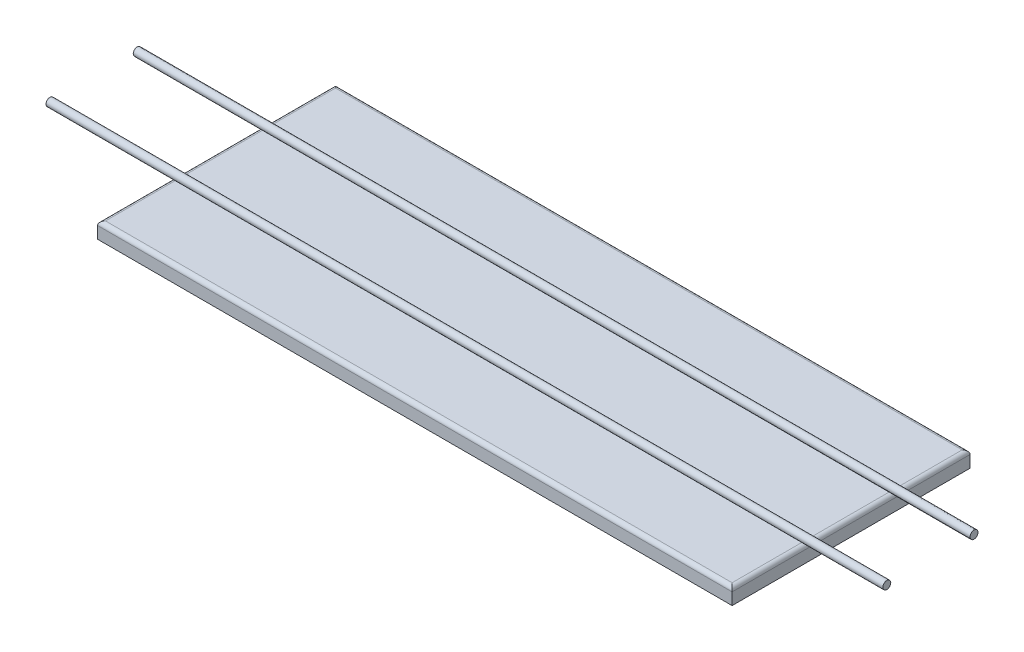
ISO-10303-21;
HEADER;
FILE_DESCRIPTION(('STEP AP214'),'2;1');
FILE_NAME('part.step','',(''),(''),'','','');
FILE_SCHEMA(('AUTOMOTIVE_DESIGN { 1 0 10303 214 1 1 1 1 }'));
ENDSEC;
DATA;
#1=APPLICATION_CONTEXT('core data for automotive mechanical design processes');
#2=APPLICATION_PROTOCOL_DEFINITION('international standard','automotive_design',2000,#1);
#3=PRODUCT_CONTEXT('',#1,'mechanical');
#4=PRODUCT('Part','Part','',(#3));
#5=PRODUCT_RELATED_PRODUCT_CATEGORY('part','',(#4));
#6=PRODUCT_DEFINITION_FORMATION('','',#4);
#7=PRODUCT_DEFINITION_CONTEXT('part definition',#1,'design');
#8=PRODUCT_DEFINITION('design','',#6,#7);
#9=PRODUCT_DEFINITION_SHAPE('','',#8);
#10=(LENGTH_UNIT() NAMED_UNIT(*) SI_UNIT(.MILLI.,.METRE.));
#11=(NAMED_UNIT(*) PLANE_ANGLE_UNIT() SI_UNIT($,.RADIAN.));
#12=(NAMED_UNIT(*) SI_UNIT($,.STERADIAN.) SOLID_ANGLE_UNIT());
#13=UNCERTAINTY_MEASURE_WITH_UNIT(LENGTH_MEASURE(1.E-05),#10,'distance_accuracy_value','');
#14=(GEOMETRIC_REPRESENTATION_CONTEXT(3) GLOBAL_UNCERTAINTY_ASSIGNED_CONTEXT((#13)) GLOBAL_UNIT_ASSIGNED_CONTEXT((#10,
#11,#12)) REPRESENTATION_CONTEXT('',''));
#15=CARTESIAN_POINT('',(0.,0.,0.));
#16=DIRECTION('',(0.,0.,1.));
#17=DIRECTION('',(1.,0.,0.));
#18=AXIS2_PLACEMENT_3D('',#15,#16,#17);
#19=CARTESIAN_POINT('',(-555.,25.0000000000001,-55.0000000000001));
#20=DIRECTION('',(1.,0.,0.));
#21=DIRECTION('',(0.,0.,-1.));
#22=AXIS2_PLACEMENT_3D('',#19,#20,#21);
#23=CYLINDRICAL_SURFACE('',#22,5.);
#24=CARTESIAN_POINT('',(-555.,25.0000000000001,-55.0000000000001));
#25=DIRECTION('',(1.,0.,0.));
#26=DIRECTION('',(0.,0.,1.));
#27=AXIS2_PLACEMENT_3D('',#24,#25,#26);
#28=CIRCLE('',#27,5.);
#29=CARTESIAN_POINT('',(-555.,25.0000000000001,-50.0000000000001));
#30=VERTEX_POINT('',#29);
#31=EDGE_CURVE('E11',#30,#30,#28,.T.);
#32=ORIENTED_EDGE('',*,*,#31,.T.);
#33=EDGE_LOOP('',(#32));
#34=FACE_BOUND('',#33,.T.);
#35=CARTESIAN_POINT('',(500.,25.0000000000001,-55.0000000000001));
#36=DIRECTION('',(1.,0.,0.));
#37=DIRECTION('',(0.,0.,1.));
#38=AXIS2_PLACEMENT_3D('',#35,#36,#37);
#39=CIRCLE('',#38,5.);
#40=CARTESIAN_POINT('',(500.,25.0000000000001,-50.0000000000001));
#41=VERTEX_POINT('',#40);
#42=EDGE_CURVE('E46',#41,#41,#39,.T.);
#43=ORIENTED_EDGE('',*,*,#42,.F.);
#44=EDGE_LOOP('',(#43));
#45=FACE_BOUND('',#44,.T.);
#46=ADVANCED_FACE('F40',(#34,#45),#23,.T.);
#47=CARTESIAN_POINT('',(-555.,25.0000000000001,-55.0000000000001));
#48=DIRECTION('',(-1.,0.,0.));
#49=DIRECTION('',(0.,0.,1.));
#50=AXIS2_PLACEMENT_3D('',#47,#48,#49);
#51=PLANE('',#50);
#52=ORIENTED_EDGE('',*,*,#31,.F.);
#53=EDGE_LOOP('',(#52));
#54=FACE_BOUND('',#53,.T.);
#55=ADVANCED_FACE('F55',(#54),#51,.T.);
#56=CARTESIAN_POINT('',(500.,25.0000000000001,-55.0000000000001));
#57=DIRECTION('',(-1.,0.,0.));
#58=DIRECTION('',(0.,0.,1.));
#59=AXIS2_PLACEMENT_3D('',#56,#57,#58);
#60=PLANE('',#59);
#61=ORIENTED_EDGE('',*,*,#42,.T.);
#62=EDGE_LOOP('',(#61));
#63=FACE_BOUND('',#62,.T.);
#64=ADVANCED_FACE('F52',(#63),#60,.F.);
#65=CLOSED_SHELL('',(#46,#55,#64));
#66=MANIFOLD_SOLID_BREP('B2',#65);
#67=CARTESIAN_POINT('',(-555.,25.,55.));
#68=DIRECTION('',(1.,0.,0.));
#69=DIRECTION('',(0.,0.,-1.));
#70=AXIS2_PLACEMENT_3D('',#67,#68,#69);
#71=CYLINDRICAL_SURFACE('',#70,5.);
#72=CARTESIAN_POINT('',(-555.,25.,55.));
#73=DIRECTION('',(1.,0.,0.));
#74=DIRECTION('',(0.,0.,-1.));
#75=AXIS2_PLACEMENT_3D('',#72,#73,#74);
#76=CIRCLE('',#75,5.);
#77=CARTESIAN_POINT('',(-555.,25.,50.));
#78=VERTEX_POINT('',#77);
#79=EDGE_CURVE('E39',#78,#78,#76,.T.);
#80=ORIENTED_EDGE('',*,*,#79,.T.);
#81=EDGE_LOOP('',(#80));
#82=FACE_BOUND('',#81,.T.);
#83=CARTESIAN_POINT('',(500.,25.,55.));
#84=DIRECTION('',(1.,0.,0.));
#85=DIRECTION('',(0.,0.,-1.));
#86=AXIS2_PLACEMENT_3D('',#83,#84,#85);
#87=CIRCLE('',#86,5.);
#88=CARTESIAN_POINT('',(500.,25.,50.));
#89=VERTEX_POINT('',#88);
#90=EDGE_CURVE('E96',#89,#89,#87,.T.);
#91=ORIENTED_EDGE('',*,*,#90,.F.);
#92=EDGE_LOOP('',(#91));
#93=FACE_BOUND('',#92,.T.);
#94=ADVANCED_FACE('F90',(#82,#93),#71,.T.);
#95=CARTESIAN_POINT('',(-555.,25.,55.));
#96=DIRECTION('',(1.,0.,0.));
#97=DIRECTION('',(0.,0.,-1.));
#98=AXIS2_PLACEMENT_3D('',#95,#96,#97);
#99=PLANE('',#98);
#100=ORIENTED_EDGE('',*,*,#79,.F.);
#101=EDGE_LOOP('',(#100));
#102=FACE_BOUND('',#101,.T.);
#103=ADVANCED_FACE('F105',(#102),#99,.F.);
#104=CARTESIAN_POINT('',(500.,25.,55.));
#105=DIRECTION('',(1.,0.,0.));
#106=DIRECTION('',(0.,0.,-1.));
#107=AXIS2_PLACEMENT_3D('',#104,#105,#106);
#108=PLANE('',#107);
#109=ORIENTED_EDGE('',*,*,#90,.T.);
#110=EDGE_LOOP('',(#109));
#111=FACE_BOUND('',#110,.T.);
#112=ADVANCED_FACE('F102',(#111),#108,.T.);
#113=CLOSED_SHELL('',(#94,#103,#112));
#114=MANIFOLD_SOLID_BREP('B6',#113);
#115=CARTESIAN_POINT('',(-400.,20.,150.));
#116=DIRECTION('',(1.,0.,0.));
#117=DIRECTION('',(0.,0.,-1.));
#118=AXIS2_PLACEMENT_3D('',#115,#116,#117);
#119=PLANE('',#118);
#120=DIRECTION('',(0.,-1.,0.));
#121=VECTOR('',#120,1.);
#122=CARTESIAN_POINT('',(-400.,20.,150.));
#123=LINE('',#122,#121);
#124=CARTESIAN_POINT('',(-400.,15.,150.));
#125=VERTEX_POINT('',#124);
#126=CARTESIAN_POINT('',(-400.,0.,150.));
#127=VERTEX_POINT('',#126);
#128=EDGE_CURVE('E182',#125,#127,#123,.T.);
#129=ORIENTED_EDGE('',*,*,#128,.F.);
#130=DIRECTION('',(0.,0.,1.));
#131=VECTOR('',#130,1.);
#132=CARTESIAN_POINT('',(-400.,15.,-150.));
#133=LINE('',#132,#131);
#134=CARTESIAN_POINT('',(-400.,15.,-150.));
#135=VERTEX_POINT('',#134);
#136=EDGE_CURVE('E88',#125,#135,#133,.F.);
#137=ORIENTED_EDGE('',*,*,#136,.T.);
#138=DIRECTION('',(0.,-1.,0.));
#139=VECTOR('',#138,1.);
#140=CARTESIAN_POINT('',(-400.,20.,-150.));
#141=LINE('',#140,#139);
#142=CARTESIAN_POINT('',(-400.,0.,-150.));
#143=VERTEX_POINT('',#142);
#144=EDGE_CURVE('E202',#135,#143,#141,.T.);
#145=ORIENTED_EDGE('',*,*,#144,.T.);
#146=DIRECTION('',(0.,0.,1.));
#147=VECTOR('',#146,1.);
#148=CARTESIAN_POINT('',(-400.,0.,150.));
#149=LINE('',#148,#147);
#150=EDGE_CURVE('E197',#143,#127,#149,.T.);
#151=ORIENTED_EDGE('',*,*,#150,.T.);
#152=EDGE_LOOP('',(#129,#137,#145,#151));
#153=FACE_BOUND('',#152,.T.);
#154=ADVANCED_FACE('F130',(#153),#119,.F.);
#155=CARTESIAN_POINT('',(400.,20.,150.));
#156=DIRECTION('',(0.,0.,-1.));
#157=DIRECTION('',(-1.,0.,0.));
#158=AXIS2_PLACEMENT_3D('',#155,#156,#157);
#159=PLANE('',#158);
#160=DIRECTION('',(0.,-1.,0.));
#161=VECTOR('',#160,1.);
#162=CARTESIAN_POINT('',(400.,20.,150.));
#163=LINE('',#162,#161);
#164=CARTESIAN_POINT('',(400.,15.,150.));
#165=VERTEX_POINT('',#164);
#166=CARTESIAN_POINT('',(400.,0.,150.));
#167=VERTEX_POINT('',#166);
#168=EDGE_CURVE('E191',#165,#167,#163,.T.);
#169=ORIENTED_EDGE('',*,*,#168,.F.);
#170=DIRECTION('',(1.,0.,0.));
#171=VECTOR('',#170,1.);
#172=CARTESIAN_POINT('',(-400.,15.,150.));
#173=LINE('',#172,#171);
#174=EDGE_CURVE('E139',#165,#125,#173,.F.);
#175=ORIENTED_EDGE('',*,*,#174,.T.);
#176=ORIENTED_EDGE('',*,*,#128,.T.);
#177=DIRECTION('',(1.,0.,0.));
#178=VECTOR('',#177,1.);
#179=CARTESIAN_POINT('',(400.,0.,150.));
#180=LINE('',#179,#178);
#181=EDGE_CURVE('E185',#127,#167,#180,.T.);
#182=ORIENTED_EDGE('',*,*,#181,.T.);
#183=EDGE_LOOP('',(#169,#175,#176,#182));
#184=FACE_BOUND('',#183,.T.);
#185=ADVANCED_FACE('F184',(#184),#159,.F.);
#186=CARTESIAN_POINT('',(400.,20.,150.));
#187=DIRECTION('',(-1.,0.,0.));
#188=DIRECTION('',(0.,0.,1.));
#189=AXIS2_PLACEMENT_3D('',#186,#187,#188);
#190=PLANE('',#189);
#191=DIRECTION('',(0.,-1.,0.));
#192=VECTOR('',#191,1.);
#193=CARTESIAN_POINT('',(400.,20.,-150.));
#194=LINE('',#193,#192);
#195=CARTESIAN_POINT('',(400.,15.,-150.));
#196=VERTEX_POINT('',#195);
#197=CARTESIAN_POINT('',(400.,0.,-150.));
#198=VERTEX_POINT('',#197);
#199=EDGE_CURVE('E212',#196,#198,#194,.T.);
#200=ORIENTED_EDGE('',*,*,#199,.F.);
#201=DIRECTION('',(0.,0.,-1.));
#202=VECTOR('',#201,1.);
#203=CARTESIAN_POINT('',(400.,15.,150.));
#204=LINE('',#203,#202);
#205=EDGE_CURVE('E154',#196,#165,#204,.F.);
#206=ORIENTED_EDGE('',*,*,#205,.T.);
#207=ORIENTED_EDGE('',*,*,#168,.T.);
#208=DIRECTION('',(0.,0.,-1.));
#209=VECTOR('',#208,1.);
#210=CARTESIAN_POINT('',(400.,0.,150.));
#211=LINE('',#210,#209);
#212=EDGE_CURVE('E199',#167,#198,#211,.T.);
#213=ORIENTED_EDGE('',*,*,#212,.T.);
#214=EDGE_LOOP('',(#200,#206,#207,#213));
#215=FACE_BOUND('',#214,.T.);
#216=ADVANCED_FACE('F250',(#215),#190,.F.);
#217=CARTESIAN_POINT('',(400.,20.,-150.));
#218=DIRECTION('',(0.,0.,1.));
#219=DIRECTION('',(1.,0.,0.));
#220=AXIS2_PLACEMENT_3D('',#217,#218,#219);
#221=PLANE('',#220);
#222=ORIENTED_EDGE('',*,*,#144,.F.);
#223=DIRECTION('',(-1.,0.,0.));
#224=VECTOR('',#223,1.);
#225=CARTESIAN_POINT('',(400.,15.,-150.));
#226=LINE('',#225,#224);
#227=EDGE_CURVE('E223',#135,#196,#226,.F.);
#228=ORIENTED_EDGE('',*,*,#227,.T.);
#229=ORIENTED_EDGE('',*,*,#199,.T.);
#230=DIRECTION('',(-1.,0.,0.));
#231=VECTOR('',#230,1.);
#232=CARTESIAN_POINT('',(400.,0.,-150.));
#233=LINE('',#232,#231);
#234=EDGE_CURVE('E209',#198,#143,#233,.T.);
#235=ORIENTED_EDGE('',*,*,#234,.T.);
#236=EDGE_LOOP('',(#222,#228,#229,#235));
#237=FACE_BOUND('',#236,.T.);
#238=ADVANCED_FACE('F249',(#237),#221,.F.);
#239=CARTESIAN_POINT('',(-400.,20.,-150.));
#240=DIRECTION('',(0.,1.,0.));
#241=DIRECTION('',(0.,0.,1.));
#242=AXIS2_PLACEMENT_3D('',#239,#240,#241);
#243=PLANE('',#242);
#244=DIRECTION('',(0.,0.,-1.));
#245=VECTOR('',#244,1.);
#246=CARTESIAN_POINT('',(395.,20.,-150.));
#247=LINE('',#246,#245);
#248=CARTESIAN_POINT('',(395.,20.,145.));
#249=VERTEX_POINT('',#248);
#250=CARTESIAN_POINT('',(395.,20.,-145.));
#251=VERTEX_POINT('',#250);
#252=EDGE_CURVE('E218',#249,#251,#247,.T.);
#253=ORIENTED_EDGE('',*,*,#252,.T.);
#254=DIRECTION('',(-1.,0.,0.));
#255=VECTOR('',#254,1.);
#256=CARTESIAN_POINT('',(-400.,20.,-145.));
#257=LINE('',#256,#255);
#258=CARTESIAN_POINT('',(-395.,20.,-145.));
#259=VERTEX_POINT('',#258);
#260=EDGE_CURVE('E220',#251,#259,#257,.T.);
#261=ORIENTED_EDGE('',*,*,#260,.T.);
#262=DIRECTION('',(0.,0.,1.));
#263=VECTOR('',#262,1.);
#264=CARTESIAN_POINT('',(-395.,20.,150.));
#265=LINE('',#264,#263);
#266=CARTESIAN_POINT('',(-395.,20.,145.));
#267=VERTEX_POINT('',#266);
#268=EDGE_CURVE('E190',#259,#267,#265,.T.);
#269=ORIENTED_EDGE('',*,*,#268,.T.);
#270=DIRECTION('',(1.,0.,0.));
#271=VECTOR('',#270,1.);
#272=CARTESIAN_POINT('',(400.,20.,145.));
#273=LINE('',#272,#271);
#274=EDGE_CURVE('E216',#267,#249,#273,.T.);
#275=ORIENTED_EDGE('',*,*,#274,.T.);
#276=EDGE_LOOP('',(#253,#261,#269,#275));
#277=FACE_BOUND('',#276,.T.);
#278=ADVANCED_FACE('F242',(#277),#243,.T.);
#279=CARTESIAN_POINT('',(-400.,0.,-150.));
#280=DIRECTION('',(0.,1.,0.));
#281=DIRECTION('',(0.,0.,1.));
#282=AXIS2_PLACEMENT_3D('',#279,#280,#281);
#283=PLANE('',#282);
#284=ORIENTED_EDGE('',*,*,#150,.F.);
#285=ORIENTED_EDGE('',*,*,#234,.F.);
#286=ORIENTED_EDGE('',*,*,#212,.F.);
#287=ORIENTED_EDGE('',*,*,#181,.F.);
#288=EDGE_LOOP('',(#284,#285,#286,#287));
#289=FACE_BOUND('',#288,.T.);
#290=ADVANCED_FACE('F195',(#289),#283,.F.);
#291=CARTESIAN_POINT('',(-400.,15.,145.));
#292=DIRECTION('',(-1.,0.,0.));
#293=DIRECTION('',(0.,0.,1.));
#294=AXIS2_PLACEMENT_3D('',#291,#292,#293);
#295=CYLINDRICAL_SURFACE('',#294,5.);
#296=CARTESIAN_POINT('',(-395.,15.,145.));
#297=DIRECTION('',(-0.707106781186548,0.,-0.707106781186547));
#298=DIRECTION('',(0.707106781186547,0.,-0.707106781186548));
#299=AXIS2_PLACEMENT_3D('',#296,#297,#298);
#300=ELLIPSE('',#299,7.07106781186548,5.);
#301=EDGE_CURVE('E206',#125,#267,#300,.T.);
#302=ORIENTED_EDGE('',*,*,#301,.F.);
#303=ORIENTED_EDGE('',*,*,#174,.F.);
#304=CARTESIAN_POINT('',(395.,15.,145.));
#305=DIRECTION('',(-0.707106781186547,0.,0.707106781186548));
#306=DIRECTION('',(-0.707106781186548,0.,-0.707106781186547));
#307=AXIS2_PLACEMENT_3D('',#304,#305,#306);
#308=ELLIPSE('',#307,7.07106781186547,5.);
#309=EDGE_CURVE('E134',#249,#165,#308,.F.);
#310=ORIENTED_EDGE('',*,*,#309,.F.);
#311=ORIENTED_EDGE('',*,*,#274,.F.);
#312=EDGE_LOOP('',(#302,#303,#310,#311));
#313=FACE_BOUND('',#312,.T.);
#314=ADVANCED_FACE('F132',(#313),#295,.T.);
#315=CARTESIAN_POINT('',(395.,15.,-150.));
#316=DIRECTION('',(0.,0.,1.));
#317=DIRECTION('',(1.,0.,0.));
#318=AXIS2_PLACEMENT_3D('',#315,#316,#317);
#319=CYLINDRICAL_SURFACE('',#318,5.);
#320=ORIENTED_EDGE('',*,*,#309,.T.);
#321=ORIENTED_EDGE('',*,*,#205,.F.);
#322=CARTESIAN_POINT('',(395.,15.,-145.));
#323=DIRECTION('',(0.707106781186548,0.,0.707106781186547));
#324=DIRECTION('',(-0.707106781186547,0.,0.707106781186547));
#325=AXIS2_PLACEMENT_3D('',#322,#323,#324);
#326=ELLIPSE('',#325,7.07106781186548,5.);
#327=EDGE_CURVE('E230',#251,#196,#326,.F.);
#328=ORIENTED_EDGE('',*,*,#327,.F.);
#329=ORIENTED_EDGE('',*,*,#252,.F.);
#330=EDGE_LOOP('',(#320,#321,#328,#329));
#331=FACE_BOUND('',#330,.T.);
#332=ADVANCED_FACE('F268',(#331),#319,.T.);
#333=CARTESIAN_POINT('',(-395.,15.,-150.));
#334=DIRECTION('',(0.,0.,-1.));
#335=DIRECTION('',(-1.,0.,0.));
#336=AXIS2_PLACEMENT_3D('',#333,#334,#335);
#337=CYLINDRICAL_SURFACE('',#336,5.);
#338=ORIENTED_EDGE('',*,*,#301,.T.);
#339=ORIENTED_EDGE('',*,*,#268,.F.);
#340=CARTESIAN_POINT('',(-395.,15.,-145.));
#341=DIRECTION('',(0.707106781186547,0.,-0.707106781186547));
#342=DIRECTION('',(-0.707106781186548,0.,-0.707106781186547));
#343=AXIS2_PLACEMENT_3D('',#340,#341,#342);
#344=ELLIPSE('',#343,7.07106781186547,5.);
#345=EDGE_CURVE('E228',#135,#259,#344,.T.);
#346=ORIENTED_EDGE('',*,*,#345,.F.);
#347=ORIENTED_EDGE('',*,*,#136,.F.);
#348=EDGE_LOOP('',(#338,#339,#346,#347));
#349=FACE_BOUND('',#348,.T.);
#350=ADVANCED_FACE('F235',(#349),#337,.T.);
#351=CARTESIAN_POINT('',(-400.,15.,-145.));
#352=DIRECTION('',(1.,0.,0.));
#353=DIRECTION('',(0.,0.,-1.));
#354=AXIS2_PLACEMENT_3D('',#351,#352,#353);
#355=CYLINDRICAL_SURFACE('',#354,5.);
#356=ORIENTED_EDGE('',*,*,#327,.T.);
#357=ORIENTED_EDGE('',*,*,#227,.F.);
#358=ORIENTED_EDGE('',*,*,#345,.T.);
#359=ORIENTED_EDGE('',*,*,#260,.F.);
#360=EDGE_LOOP('',(#356,#357,#358,#359));
#361=FACE_BOUND('',#360,.T.);
#362=ADVANCED_FACE('F246',(#361),#355,.T.);
#363=CLOSED_SHELL('',(#154,#185,#216,#238,#278,#290,#314,#332,#350,#362));
#364=MANIFOLD_SOLID_BREP('B34',#363);
#365=ADVANCED_BREP_SHAPE_REPRESENTATION('',(#18,#66,#114,#364),#14);
#366=SHAPE_DEFINITION_REPRESENTATION(#9,#365);
ENDSEC;
END-ISO-10303-21;
